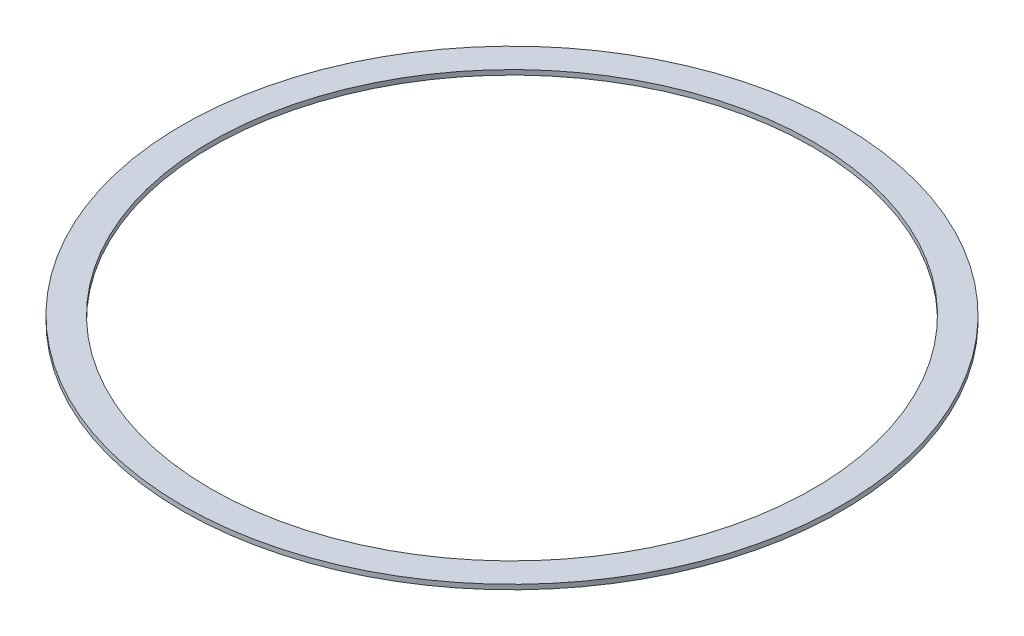
ISO-10303-21;
HEADER;
FILE_DESCRIPTION(('STEP AP214'),'2;1');
FILE_NAME('part.step','',(''),(''),'','','');
FILE_SCHEMA(('AUTOMOTIVE_DESIGN { 1 0 10303 214 1 1 1 1 }'));
ENDSEC;
DATA;
#1=APPLICATION_CONTEXT('core data for automotive mechanical design processes');
#2=APPLICATION_PROTOCOL_DEFINITION('international standard','automotive_design',2000,#1);
#3=PRODUCT_CONTEXT('',#1,'mechanical');
#4=PRODUCT('Part','Part','',(#3));
#5=PRODUCT_RELATED_PRODUCT_CATEGORY('part','',(#4));
#6=PRODUCT_DEFINITION_FORMATION('','',#4);
#7=PRODUCT_DEFINITION_CONTEXT('part definition',#1,'design');
#8=PRODUCT_DEFINITION('design','',#6,#7);
#9=PRODUCT_DEFINITION_SHAPE('','',#8);
#10=(LENGTH_UNIT() NAMED_UNIT(*) SI_UNIT(.MILLI.,.METRE.));
#11=(NAMED_UNIT(*) PLANE_ANGLE_UNIT() SI_UNIT($,.RADIAN.));
#12=(NAMED_UNIT(*) SI_UNIT($,.STERADIAN.) SOLID_ANGLE_UNIT());
#13=UNCERTAINTY_MEASURE_WITH_UNIT(LENGTH_MEASURE(1.E-05),#10,'distance_accuracy_value','');
#14=(GEOMETRIC_REPRESENTATION_CONTEXT(3) GLOBAL_UNCERTAINTY_ASSIGNED_CONTEXT((#13)) GLOBAL_UNIT_ASSIGNED_CONTEXT((#10,
#11,#12)) REPRESENTATION_CONTEXT('',''));
#15=CARTESIAN_POINT('',(0.,0.,0.));
#16=DIRECTION('',(0.,0.,1.));
#17=DIRECTION('',(1.,0.,0.));
#18=AXIS2_PLACEMENT_3D('',#15,#16,#17);
#19=CARTESIAN_POINT('',(-843.703209974749,2.54,2673.0689722255));
#20=DIRECTION('',(0.,1.,0.));
#21=DIRECTION('',(0.,0.,1.));
#22=AXIS2_PLACEMENT_3D('',#19,#20,#21);
#23=PLANE('',#22);
#24=CARTESIAN_POINT('',(-843.703209974749,2.54,2673.0689722255));
#25=DIRECTION('',(0.,1.,0.));
#26=DIRECTION('',(0.,0.,1.));
#27=AXIS2_PLACEMENT_3D('',#24,#25,#26);
#28=CIRCLE('',#27,175.26);
#29=CARTESIAN_POINT('',(-843.703209974749,2.54,2848.3289722255));
#30=VERTEX_POINT('',#29);
#31=EDGE_CURVE('E10',#30,#30,#28,.T.);
#32=ORIENTED_EDGE('',*,*,#31,.T.);
#33=EDGE_LOOP('',(#32));
#34=FACE_BOUND('',#33,.T.);
#35=CARTESIAN_POINT('',(-843.703209974749,2.54,2673.0689722255));
#36=DIRECTION('',(0.,1.,0.));
#37=DIRECTION('',(0.,0.,1.));
#38=AXIS2_PLACEMENT_3D('',#35,#36,#37);
#39=CIRCLE('',#38,160.02);
#40=CARTESIAN_POINT('',(-843.703209974749,2.54,2833.0889722255));
#41=VERTEX_POINT('',#40);
#42=EDGE_CURVE('E42',#41,#41,#39,.T.);
#43=ORIENTED_EDGE('',*,*,#42,.F.);
#44=EDGE_LOOP('',(#43));
#45=FACE_BOUND('',#44,.T.);
#46=ADVANCED_FACE('F31',(#34,#45),#23,.T.);
#47=CARTESIAN_POINT('',(-843.703209974749,0.,2673.0689722255));
#48=DIRECTION('',(0.,1.,0.));
#49=DIRECTION('',(0.,0.,1.));
#50=AXIS2_PLACEMENT_3D('',#47,#48,#49);
#51=PLANE('',#50);
#52=CARTESIAN_POINT('',(-843.703209974749,0.,2673.0689722255));
#53=DIRECTION('',(0.,1.,0.));
#54=DIRECTION('',(0.,0.,1.));
#55=AXIS2_PLACEMENT_3D('',#52,#53,#54);
#56=CIRCLE('',#55,175.26);
#57=CARTESIAN_POINT('',(-843.703209974749,0.,2848.3289722255));
#58=VERTEX_POINT('',#57);
#59=EDGE_CURVE('E35',#58,#58,#56,.T.);
#60=ORIENTED_EDGE('',*,*,#59,.F.);
#61=EDGE_LOOP('',(#60));
#62=FACE_BOUND('',#61,.T.);
#63=CARTESIAN_POINT('',(-843.703209974749,0.,2673.0689722255));
#64=DIRECTION('',(0.,1.,0.));
#65=DIRECTION('',(0.,0.,1.));
#66=AXIS2_PLACEMENT_3D('',#63,#64,#65);
#67=CIRCLE('',#66,160.02);
#68=CARTESIAN_POINT('',(-843.703209974749,0.,2833.0889722255));
#69=VERTEX_POINT('',#68);
#70=EDGE_CURVE('E44',#69,#69,#67,.T.);
#71=ORIENTED_EDGE('',*,*,#70,.T.);
#72=EDGE_LOOP('',(#71));
#73=FACE_BOUND('',#72,.T.);
#74=ADVANCED_FACE('F54',(#62,#73),#51,.F.);
#75=CARTESIAN_POINT('',(-843.703209974749,2.54,2673.0689722255));
#76=DIRECTION('',(0.,-1.,0.));
#77=DIRECTION('',(0.,0.,-1.));
#78=AXIS2_PLACEMENT_3D('',#75,#76,#77);
#79=CYLINDRICAL_SURFACE('',#78,175.26);
#80=ORIENTED_EDGE('',*,*,#31,.F.);
#81=EDGE_LOOP('',(#80));
#82=FACE_BOUND('',#81,.T.);
#83=ORIENTED_EDGE('',*,*,#59,.T.);
#84=EDGE_LOOP('',(#83));
#85=FACE_BOUND('',#84,.T.);
#86=ADVANCED_FACE('F33',(#82,#85),#79,.T.);
#87=CARTESIAN_POINT('',(-843.703209974749,2.54,2673.0689722255));
#88=DIRECTION('',(0.,-1.,0.));
#89=DIRECTION('',(0.,0.,-1.));
#90=AXIS2_PLACEMENT_3D('',#87,#88,#89);
#91=CYLINDRICAL_SURFACE('',#90,160.02);
#92=ORIENTED_EDGE('',*,*,#42,.T.);
#93=EDGE_LOOP('',(#92));
#94=FACE_BOUND('',#93,.T.);
#95=ORIENTED_EDGE('',*,*,#70,.F.);
#96=EDGE_LOOP('',(#95));
#97=FACE_BOUND('',#96,.T.);
#98=ADVANCED_FACE('F50',(#94,#97),#91,.F.);
#99=CLOSED_SHELL('',(#46,#74,#86,#98));
#100=MANIFOLD_SOLID_BREP('B2',#99);
#101=ADVANCED_BREP_SHAPE_REPRESENTATION('',(#18,#100),#14);
#102=SHAPE_DEFINITION_REPRESENTATION(#9,#101);
ENDSEC;
END-ISO-10303-21;
